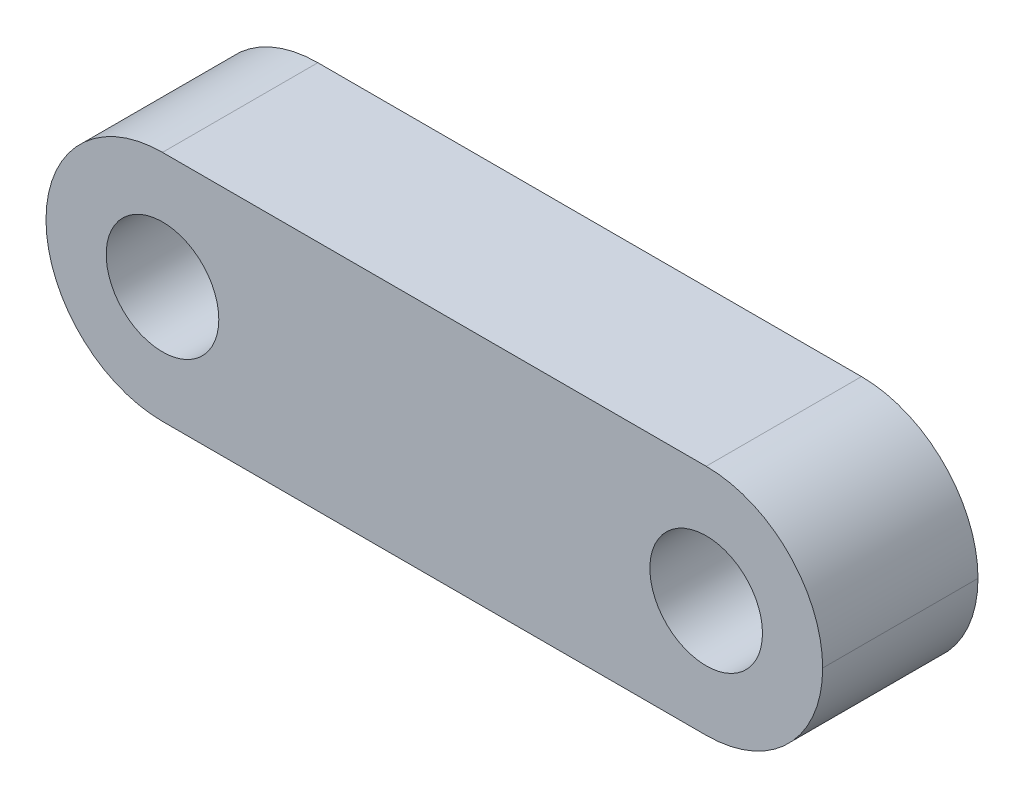
ISO-10303-21;
HEADER;
FILE_DESCRIPTION(('STEP AP214'),'2;1');
FILE_NAME('part.step','',(''),(''),'','','');
FILE_SCHEMA(('AUTOMOTIVE_DESIGN { 1 0 10303 214 1 1 1 1 }'));
ENDSEC;
DATA;
#1=APPLICATION_CONTEXT('core data for automotive mechanical design processes');
#2=APPLICATION_PROTOCOL_DEFINITION('international standard','automotive_design',2000,#1);
#3=PRODUCT_CONTEXT('',#1,'mechanical');
#4=PRODUCT('Part','Part','',(#3));
#5=PRODUCT_RELATED_PRODUCT_CATEGORY('part','',(#4));
#6=PRODUCT_DEFINITION_FORMATION('','',#4);
#7=PRODUCT_DEFINITION_CONTEXT('part definition',#1,'design');
#8=PRODUCT_DEFINITION('design','',#6,#7);
#9=PRODUCT_DEFINITION_SHAPE('','',#8);
#10=(LENGTH_UNIT() NAMED_UNIT(*) SI_UNIT(.MILLI.,.METRE.));
#11=(NAMED_UNIT(*) PLANE_ANGLE_UNIT() SI_UNIT($,.RADIAN.));
#12=(NAMED_UNIT(*) SI_UNIT($,.STERADIAN.) SOLID_ANGLE_UNIT());
#13=UNCERTAINTY_MEASURE_WITH_UNIT(LENGTH_MEASURE(1.E-05),#10,'distance_accuracy_value','');
#14=(GEOMETRIC_REPRESENTATION_CONTEXT(3) GLOBAL_UNCERTAINTY_ASSIGNED_CONTEXT((#13)) GLOBAL_UNIT_ASSIGNED_CONTEXT((#10,
#11,#12)) REPRESENTATION_CONTEXT('',''));
#15=CARTESIAN_POINT('',(0.,0.,0.));
#16=DIRECTION('',(0.,0.,1.));
#17=DIRECTION('',(1.,0.,0.));
#18=AXIS2_PLACEMENT_3D('',#15,#16,#17);
#19=CARTESIAN_POINT('',(0.,-6.,4.));
#20=DIRECTION('',(0.,1.,0.));
#21=DIRECTION('',(0.,0.,1.));
#22=AXIS2_PLACEMENT_3D('',#19,#20,#21);
#23=PLANE('',#22);
#24=DIRECTION('',(1.,0.,0.));
#25=VECTOR('',#24,1.);
#26=CARTESIAN_POINT('',(0.,-6.,0.));
#27=LINE('',#26,#25);
#28=CARTESIAN_POINT('',(3.,-6.,0.));
#29=VERTEX_POINT('',#28);
#30=CARTESIAN_POINT('',(17.,-6.,0.));
#31=VERTEX_POINT('',#30);
#32=EDGE_CURVE('E92',#29,#31,#27,.T.);
#33=ORIENTED_EDGE('',*,*,#32,.T.);
#34=DIRECTION('',(0.,0.,-1.));
#35=VECTOR('',#34,1.);
#36=CARTESIAN_POINT('',(17.,-6.,4.));
#37=LINE('',#36,#35);
#38=CARTESIAN_POINT('',(17.,-6.,4.));
#39=VERTEX_POINT('',#38);
#40=EDGE_CURVE('E124',#31,#39,#37,.F.);
#41=ORIENTED_EDGE('',*,*,#40,.T.);
#42=DIRECTION('',(1.,0.,0.));
#43=VECTOR('',#42,1.);
#44=CARTESIAN_POINT('',(0.,-6.,4.));
#45=LINE('',#44,#43);
#46=CARTESIAN_POINT('',(3.,-6.,4.));
#47=VERTEX_POINT('',#46);
#48=EDGE_CURVE('E134',#47,#39,#45,.T.);
#49=ORIENTED_EDGE('',*,*,#48,.F.);
#50=DIRECTION('',(0.,0.,-1.));
#51=VECTOR('',#50,1.);
#52=CARTESIAN_POINT('',(3.,-6.,4.));
#53=LINE('',#52,#51);
#54=EDGE_CURVE('E127',#47,#29,#53,.T.);
#55=ORIENTED_EDGE('',*,*,#54,.T.);
#56=EDGE_LOOP('',(#33,#41,#49,#55));
#57=FACE_BOUND('',#56,.T.);
#58=ADVANCED_FACE('F33',(#57),#23,.F.);
#59=CARTESIAN_POINT('',(0.,0.,4.));
#60=DIRECTION('',(0.,-1.,0.));
#61=DIRECTION('',(0.,0.,-1.));
#62=AXIS2_PLACEMENT_3D('',#59,#60,#61);
#63=PLANE('',#62);
#64=DIRECTION('',(-1.,0.,0.));
#65=VECTOR('',#64,1.);
#66=CARTESIAN_POINT('',(0.,0.,4.));
#67=LINE('',#66,#65);
#68=CARTESIAN_POINT('',(17.,0.,4.));
#69=VERTEX_POINT('',#68);
#70=CARTESIAN_POINT('',(3.,0.,4.));
#71=VERTEX_POINT('',#70);
#72=EDGE_CURVE('E103',#69,#71,#67,.T.);
#73=ORIENTED_EDGE('',*,*,#72,.F.);
#74=DIRECTION('',(0.,0.,-1.));
#75=VECTOR('',#74,1.);
#76=CARTESIAN_POINT('',(17.,0.,4.));
#77=LINE('',#76,#75);
#78=CARTESIAN_POINT('',(17.,0.,0.));
#79=VERTEX_POINT('',#78);
#80=EDGE_CURVE('E11',#69,#79,#77,.T.);
#81=ORIENTED_EDGE('',*,*,#80,.T.);
#82=DIRECTION('',(-1.,0.,0.));
#83=VECTOR('',#82,1.);
#84=CARTESIAN_POINT('',(0.,0.,0.));
#85=LINE('',#84,#83);
#86=CARTESIAN_POINT('',(3.,0.,0.));
#87=VERTEX_POINT('',#86);
#88=EDGE_CURVE('E132',#79,#87,#85,.T.);
#89=ORIENTED_EDGE('',*,*,#88,.T.);
#90=DIRECTION('',(0.,0.,-1.));
#91=VECTOR('',#90,1.);
#92=CARTESIAN_POINT('',(3.,0.,4.));
#93=LINE('',#92,#91);
#94=EDGE_CURVE('E42',#87,#71,#93,.F.);
#95=ORIENTED_EDGE('',*,*,#94,.T.);
#96=EDGE_LOOP('',(#73,#81,#89,#95));
#97=FACE_BOUND('',#96,.T.);
#98=ADVANCED_FACE('F154',(#97),#63,.F.);
#99=CARTESIAN_POINT('',(0.,0.,4.));
#100=DIRECTION('',(0.,0.,1.));
#101=DIRECTION('',(1.,0.,0.));
#102=AXIS2_PLACEMENT_3D('',#99,#100,#101);
#103=PLANE('',#102);
#104=CARTESIAN_POINT('',(17.,-3.,4.));
#105=DIRECTION('',(0.,0.,1.));
#106=DIRECTION('',(1.,0.,0.));
#107=AXIS2_PLACEMENT_3D('',#104,#105,#106);
#108=CIRCLE('',#107,1.45);
#109=CARTESIAN_POINT('',(18.45,-3.,4.));
#110=VERTEX_POINT('',#109);
#111=EDGE_CURVE('E114',#110,#110,#108,.T.);
#112=ORIENTED_EDGE('',*,*,#111,.F.);
#113=EDGE_LOOP('',(#112));
#114=FACE_BOUND('',#113,.T.);
#115=CARTESIAN_POINT('',(3.,-3.,4.));
#116=DIRECTION('',(0.,0.,1.));
#117=DIRECTION('',(1.,0.,0.));
#118=AXIS2_PLACEMENT_3D('',#115,#116,#117);
#119=CIRCLE('',#118,1.45);
#120=CARTESIAN_POINT('',(4.45,-3.,4.));
#121=VERTEX_POINT('',#120);
#122=EDGE_CURVE('E136',#121,#121,#119,.T.);
#123=ORIENTED_EDGE('',*,*,#122,.F.);
#124=EDGE_LOOP('',(#123));
#125=FACE_BOUND('',#124,.T.);
#126=ORIENTED_EDGE('',*,*,#48,.T.);
#127=CARTESIAN_POINT('',(17.,-3.,4.));
#128=DIRECTION('',(0.,0.,1.));
#129=DIRECTION('',(1.,0.,0.));
#130=AXIS2_PLACEMENT_3D('',#127,#128,#129);
#131=CIRCLE('',#130,3.);
#132=CARTESIAN_POINT('',(20.,-3.,4.));
#133=VERTEX_POINT('',#132);
#134=EDGE_CURVE('E118',#39,#133,#131,.T.);
#135=ORIENTED_EDGE('',*,*,#134,.T.);
#136=CARTESIAN_POINT('',(17.,-3.,4.));
#137=DIRECTION('',(0.,0.,1.));
#138=DIRECTION('',(1.,0.,0.));
#139=AXIS2_PLACEMENT_3D('',#136,#137,#138);
#140=CIRCLE('',#139,3.);
#141=EDGE_CURVE('E56',#133,#69,#140,.T.);
#142=ORIENTED_EDGE('',*,*,#141,.T.);
#143=ORIENTED_EDGE('',*,*,#72,.T.);
#144=CARTESIAN_POINT('',(3.,-3.,4.));
#145=DIRECTION('',(0.,0.,1.));
#146=DIRECTION('',(1.,0.,0.));
#147=AXIS2_PLACEMENT_3D('',#144,#145,#146);
#148=CIRCLE('',#147,3.);
#149=CARTESIAN_POINT('',(0.,-3.,4.));
#150=VERTEX_POINT('',#149);
#151=EDGE_CURVE('E122',#71,#150,#148,.T.);
#152=ORIENTED_EDGE('',*,*,#151,.T.);
#153=CARTESIAN_POINT('',(3.,-3.,4.));
#154=DIRECTION('',(0.,0.,1.));
#155=DIRECTION('',(1.,0.,0.));
#156=AXIS2_PLACEMENT_3D('',#153,#154,#155);
#157=CIRCLE('',#156,3.);
#158=EDGE_CURVE('E106',#150,#47,#157,.T.);
#159=ORIENTED_EDGE('',*,*,#158,.T.);
#160=EDGE_LOOP('',(#126,#135,#142,#143,#152,#159));
#161=FACE_BOUND('',#160,.T.);
#162=ADVANCED_FACE('F151',(#114,#125,#161),#103,.T.);
#163=CARTESIAN_POINT('',(0.,0.,0.));
#164=DIRECTION('',(0.,0.,1.));
#165=DIRECTION('',(1.,0.,0.));
#166=AXIS2_PLACEMENT_3D('',#163,#164,#165);
#167=PLANE('',#166);
#168=CARTESIAN_POINT('',(17.,-3.,0.));
#169=DIRECTION('',(0.,0.,1.));
#170=DIRECTION('',(1.,0.,0.));
#171=AXIS2_PLACEMENT_3D('',#168,#169,#170);
#172=CIRCLE('',#171,1.45);
#173=CARTESIAN_POINT('',(18.45,-3.,0.));
#174=VERTEX_POINT('',#173);
#175=EDGE_CURVE('E109',#174,#174,#172,.T.);
#176=ORIENTED_EDGE('',*,*,#175,.T.);
#177=EDGE_LOOP('',(#176));
#178=FACE_BOUND('',#177,.T.);
#179=CARTESIAN_POINT('',(3.,-3.,0.));
#180=DIRECTION('',(0.,0.,1.));
#181=DIRECTION('',(1.,0.,0.));
#182=AXIS2_PLACEMENT_3D('',#179,#180,#181);
#183=CIRCLE('',#182,1.45);
#184=CARTESIAN_POINT('',(4.45,-3.,0.));
#185=VERTEX_POINT('',#184);
#186=EDGE_CURVE('E142',#185,#185,#183,.T.);
#187=ORIENTED_EDGE('',*,*,#186,.T.);
#188=EDGE_LOOP('',(#187));
#189=FACE_BOUND('',#188,.T.);
#190=CARTESIAN_POINT('',(17.,-3.,0.));
#191=DIRECTION('',(0.,0.,1.));
#192=DIRECTION('',(1.,0.,0.));
#193=AXIS2_PLACEMENT_3D('',#190,#191,#192);
#194=CIRCLE('',#193,3.);
#195=CARTESIAN_POINT('',(20.,-3.,0.));
#196=VERTEX_POINT('',#195);
#197=EDGE_CURVE('E97',#79,#196,#194,.F.);
#198=ORIENTED_EDGE('',*,*,#197,.T.);
#199=CARTESIAN_POINT('',(17.,-3.,0.));
#200=DIRECTION('',(0.,0.,1.));
#201=DIRECTION('',(1.,0.,0.));
#202=AXIS2_PLACEMENT_3D('',#199,#200,#201);
#203=CIRCLE('',#202,3.);
#204=EDGE_CURVE('E129',#196,#31,#203,.F.);
#205=ORIENTED_EDGE('',*,*,#204,.T.);
#206=ORIENTED_EDGE('',*,*,#32,.F.);
#207=CARTESIAN_POINT('',(3.,-3.,0.));
#208=DIRECTION('',(0.,0.,1.));
#209=DIRECTION('',(1.,0.,0.));
#210=AXIS2_PLACEMENT_3D('',#207,#208,#209);
#211=CIRCLE('',#210,3.);
#212=CARTESIAN_POINT('',(0.,-3.,0.));
#213=VERTEX_POINT('',#212);
#214=EDGE_CURVE('E86',#29,#213,#211,.F.);
#215=ORIENTED_EDGE('',*,*,#214,.T.);
#216=CARTESIAN_POINT('',(3.,-3.,0.));
#217=DIRECTION('',(0.,0.,1.));
#218=DIRECTION('',(1.,0.,0.));
#219=AXIS2_PLACEMENT_3D('',#216,#217,#218);
#220=CIRCLE('',#219,3.);
#221=EDGE_CURVE('E90',#213,#87,#220,.F.);
#222=ORIENTED_EDGE('',*,*,#221,.T.);
#223=ORIENTED_EDGE('',*,*,#88,.F.);
#224=EDGE_LOOP('',(#198,#205,#206,#215,#222,#223));
#225=FACE_BOUND('',#224,.T.);
#226=ADVANCED_FACE('F88',(#178,#189,#225),#167,.F.);
#227=CARTESIAN_POINT('',(3.,-3.,0.));
#228=DIRECTION('',(0.,0.,1.));
#229=DIRECTION('',(1.,0.,0.));
#230=AXIS2_PLACEMENT_3D('',#227,#228,#229);
#231=CYLINDRICAL_SURFACE('',#230,1.45);
#232=ORIENTED_EDGE('',*,*,#122,.T.);
#233=EDGE_LOOP('',(#232));
#234=FACE_BOUND('',#233,.T.);
#235=ORIENTED_EDGE('',*,*,#186,.F.);
#236=EDGE_LOOP('',(#235));
#237=FACE_BOUND('',#236,.T.);
#238=ADVANCED_FACE('F197',(#234,#237),#231,.F.);
#239=CARTESIAN_POINT('',(17.,-3.,0.));
#240=DIRECTION('',(0.,0.,1.));
#241=DIRECTION('',(1.,0.,0.));
#242=AXIS2_PLACEMENT_3D('',#239,#240,#241);
#243=CYLINDRICAL_SURFACE('',#242,1.45);
#244=ORIENTED_EDGE('',*,*,#111,.T.);
#245=EDGE_LOOP('',(#244));
#246=FACE_BOUND('',#245,.T.);
#247=ORIENTED_EDGE('',*,*,#175,.F.);
#248=EDGE_LOOP('',(#247));
#249=FACE_BOUND('',#248,.T.);
#250=ADVANCED_FACE('F148',(#246,#249),#243,.F.);
#251=CARTESIAN_POINT('',(17.,-3.,4.));
#252=DIRECTION('',(0.,0.,-1.));
#253=DIRECTION('',(-1.,0.,0.));
#254=AXIS2_PLACEMENT_3D('',#251,#252,#253);
#255=CYLINDRICAL_SURFACE('',#254,3.);
#256=ORIENTED_EDGE('',*,*,#80,.F.);
#257=ORIENTED_EDGE('',*,*,#141,.F.);
#258=DIRECTION('',(0.,0.,-1.));
#259=VECTOR('',#258,1.);
#260=CARTESIAN_POINT('',(20.,-3.,4.));
#261=LINE('',#260,#259);
#262=EDGE_CURVE('E107',#196,#133,#261,.F.);
#263=ORIENTED_EDGE('',*,*,#262,.F.);
#264=ORIENTED_EDGE('',*,*,#197,.F.);
#265=EDGE_LOOP('',(#256,#257,#263,#264));
#266=FACE_BOUND('',#265,.T.);
#267=ADVANCED_FACE('F164',(#266),#255,.T.);
#268=CARTESIAN_POINT('',(17.,-3.,4.));
#269=DIRECTION('',(0.,0.,-1.));
#270=DIRECTION('',(-1.,0.,0.));
#271=AXIS2_PLACEMENT_3D('',#268,#269,#270);
#272=CYLINDRICAL_SURFACE('',#271,3.);
#273=ORIENTED_EDGE('',*,*,#134,.F.);
#274=ORIENTED_EDGE('',*,*,#40,.F.);
#275=ORIENTED_EDGE('',*,*,#204,.F.);
#276=ORIENTED_EDGE('',*,*,#262,.T.);
#277=EDGE_LOOP('',(#273,#274,#275,#276));
#278=FACE_BOUND('',#277,.T.);
#279=ADVANCED_FACE('F160',(#278),#272,.T.);
#280=CARTESIAN_POINT('',(3.,-3.,4.));
#281=DIRECTION('',(0.,0.,-1.));
#282=DIRECTION('',(-1.,0.,0.));
#283=AXIS2_PLACEMENT_3D('',#280,#281,#282);
#284=CYLINDRICAL_SURFACE('',#283,3.);
#285=DIRECTION('',(0.,0.,-1.));
#286=VECTOR('',#285,1.);
#287=CARTESIAN_POINT('',(0.,-3.,4.));
#288=LINE('',#287,#286);
#289=EDGE_CURVE('E37',#150,#213,#288,.T.);
#290=ORIENTED_EDGE('',*,*,#289,.F.);
#291=ORIENTED_EDGE('',*,*,#151,.F.);
#292=ORIENTED_EDGE('',*,*,#94,.F.);
#293=ORIENTED_EDGE('',*,*,#221,.F.);
#294=EDGE_LOOP('',(#290,#291,#292,#293));
#295=FACE_BOUND('',#294,.T.);
#296=ADVANCED_FACE('F35',(#295),#284,.T.);
#297=CARTESIAN_POINT('',(3.,-3.,4.));
#298=DIRECTION('',(0.,0.,-1.));
#299=DIRECTION('',(-1.,0.,0.));
#300=AXIS2_PLACEMENT_3D('',#297,#298,#299);
#301=CYLINDRICAL_SURFACE('',#300,3.);
#302=ORIENTED_EDGE('',*,*,#158,.F.);
#303=ORIENTED_EDGE('',*,*,#289,.T.);
#304=ORIENTED_EDGE('',*,*,#214,.F.);
#305=ORIENTED_EDGE('',*,*,#54,.F.);
#306=EDGE_LOOP('',(#302,#303,#304,#305));
#307=FACE_BOUND('',#306,.T.);
#308=ADVANCED_FACE('F105',(#307),#301,.T.);
#309=CLOSED_SHELL('',(#58,#98,#162,#226,#238,#250,#267,#279,#296,#308));
#310=MANIFOLD_SOLID_BREP('B2',#309);
#311=ADVANCED_BREP_SHAPE_REPRESENTATION('',(#18,#310),#14);
#312=SHAPE_DEFINITION_REPRESENTATION(#9,#311);
ENDSEC;
END-ISO-10303-21;
